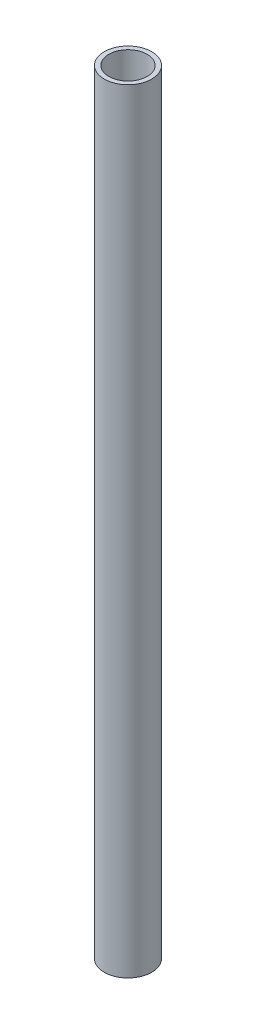
ISO-10303-21;
HEADER;
FILE_DESCRIPTION(('STEP AP214'),'2;1');
FILE_NAME('part.step','',(''),(''),'','','');
FILE_SCHEMA(('AUTOMOTIVE_DESIGN { 1 0 10303 214 1 1 1 1 }'));
ENDSEC;
DATA;
#1=APPLICATION_CONTEXT('core data for automotive mechanical design processes');
#2=APPLICATION_PROTOCOL_DEFINITION('international standard','automotive_design',2000,#1);
#3=PRODUCT_CONTEXT('',#1,'mechanical');
#4=PRODUCT('Part','Part','',(#3));
#5=PRODUCT_RELATED_PRODUCT_CATEGORY('part','',(#4));
#6=PRODUCT_DEFINITION_FORMATION('','',#4);
#7=PRODUCT_DEFINITION_CONTEXT('part definition',#1,'design');
#8=PRODUCT_DEFINITION('design','',#6,#7);
#9=PRODUCT_DEFINITION_SHAPE('','',#8);
#10=(LENGTH_UNIT() NAMED_UNIT(*) SI_UNIT(.MILLI.,.METRE.));
#11=(NAMED_UNIT(*) PLANE_ANGLE_UNIT() SI_UNIT($,.RADIAN.));
#12=(NAMED_UNIT(*) SI_UNIT($,.STERADIAN.) SOLID_ANGLE_UNIT());
#13=UNCERTAINTY_MEASURE_WITH_UNIT(LENGTH_MEASURE(1.E-05),#10,'distance_accuracy_value','');
#14=(GEOMETRIC_REPRESENTATION_CONTEXT(3) GLOBAL_UNCERTAINTY_ASSIGNED_CONTEXT((#13)) GLOBAL_UNIT_ASSIGNED_CONTEXT((#10,
#11,#12)) REPRESENTATION_CONTEXT('',''));
#15=CARTESIAN_POINT('',(0.,0.,0.));
#16=DIRECTION('',(0.,0.,1.));
#17=DIRECTION('',(1.,0.,0.));
#18=AXIS2_PLACEMENT_3D('',#15,#16,#17);
#19=CARTESIAN_POINT('',(0.,414.02,0.));
#20=DIRECTION('',(0.,-1.,0.));
#21=DIRECTION('',(0.,0.,-1.));
#22=AXIS2_PLACEMENT_3D('',#19,#20,#21);
#23=CYLINDRICAL_SURFACE('',#22,12.7);
#24=CARTESIAN_POINT('',(0.,414.02,0.));
#25=DIRECTION('',(0.,1.,0.));
#26=DIRECTION('',(0.,0.,1.));
#27=AXIS2_PLACEMENT_3D('',#24,#25,#26);
#28=CIRCLE('',#27,12.7);
#29=CARTESIAN_POINT('',(0.,414.02,12.7));
#30=VERTEX_POINT('',#29);
#31=EDGE_CURVE('E10',#30,#30,#28,.T.);
#32=ORIENTED_EDGE('',*,*,#31,.F.);
#33=EDGE_LOOP('',(#32));
#34=FACE_BOUND('',#33,.T.);
#35=CARTESIAN_POINT('',(0.,0.,0.));
#36=DIRECTION('',(0.,1.,0.));
#37=DIRECTION('',(0.,0.,1.));
#38=AXIS2_PLACEMENT_3D('',#35,#36,#37);
#39=CIRCLE('',#38,12.7);
#40=CARTESIAN_POINT('',(0.,0.,12.7));
#41=VERTEX_POINT('',#40);
#42=EDGE_CURVE('E37',#41,#41,#39,.T.);
#43=ORIENTED_EDGE('',*,*,#42,.T.);
#44=EDGE_LOOP('',(#43));
#45=FACE_BOUND('',#44,.T.);
#46=ADVANCED_FACE('F34',(#34,#45),#23,.T.);
#47=CARTESIAN_POINT('',(0.,414.02,0.));
#48=DIRECTION('',(0.,1.,0.));
#49=DIRECTION('',(0.,0.,1.));
#50=AXIS2_PLACEMENT_3D('',#47,#48,#49);
#51=PLANE('',#50);
#52=CARTESIAN_POINT('',(0.,414.02,0.));
#53=DIRECTION('',(0.,1.,0.));
#54=DIRECTION('',(0.,0.,1.));
#55=AXIS2_PLACEMENT_3D('',#52,#53,#54);
#56=CIRCLE('',#55,10.287);
#57=CARTESIAN_POINT('',(0.,414.02,10.287));
#58=VERTEX_POINT('',#57);
#59=EDGE_CURVE('E44',#58,#58,#56,.T.);
#60=ORIENTED_EDGE('',*,*,#59,.F.);
#61=EDGE_LOOP('',(#60));
#62=FACE_BOUND('',#61,.T.);
#63=ORIENTED_EDGE('',*,*,#31,.T.);
#64=EDGE_LOOP('',(#63));
#65=FACE_BOUND('',#64,.T.);
#66=ADVANCED_FACE('F63',(#62,#65),#51,.T.);
#67=CARTESIAN_POINT('',(0.,0.,0.));
#68=DIRECTION('',(0.,1.,0.));
#69=DIRECTION('',(0.,0.,1.));
#70=AXIS2_PLACEMENT_3D('',#67,#68,#69);
#71=PLANE('',#70);
#72=CARTESIAN_POINT('',(0.,0.,0.));
#73=DIRECTION('',(0.,1.,0.));
#74=DIRECTION('',(0.,0.,1.));
#75=AXIS2_PLACEMENT_3D('',#72,#73,#74);
#76=CIRCLE('',#75,10.287);
#77=CARTESIAN_POINT('',(0.,0.,10.287));
#78=VERTEX_POINT('',#77);
#79=EDGE_CURVE('E48',#78,#78,#76,.T.);
#80=ORIENTED_EDGE('',*,*,#79,.T.);
#81=EDGE_LOOP('',(#80));
#82=FACE_BOUND('',#81,.T.);
#83=ORIENTED_EDGE('',*,*,#42,.F.);
#84=EDGE_LOOP('',(#83));
#85=FACE_BOUND('',#84,.T.);
#86=ADVANCED_FACE('F52',(#82,#85),#71,.F.);
#87=CARTESIAN_POINT('',(0.,414.02,0.));
#88=DIRECTION('',(0.,-1.,0.));
#89=DIRECTION('',(0.,0.,-1.));
#90=AXIS2_PLACEMENT_3D('',#87,#88,#89);
#91=CYLINDRICAL_SURFACE('',#90,10.287);
#92=ORIENTED_EDGE('',*,*,#59,.T.);
#93=EDGE_LOOP('',(#92));
#94=FACE_BOUND('',#93,.T.);
#95=ORIENTED_EDGE('',*,*,#79,.F.);
#96=EDGE_LOOP('',(#95));
#97=FACE_BOUND('',#96,.T.);
#98=ADVANCED_FACE('F55',(#94,#97),#91,.F.);
#99=CLOSED_SHELL('',(#46,#66,#86,#98));
#100=MANIFOLD_SOLID_BREP('B2',#99);
#101=ADVANCED_BREP_SHAPE_REPRESENTATION('',(#18,#100),#14);
#102=SHAPE_DEFINITION_REPRESENTATION(#9,#101);
ENDSEC;
END-ISO-10303-21;
